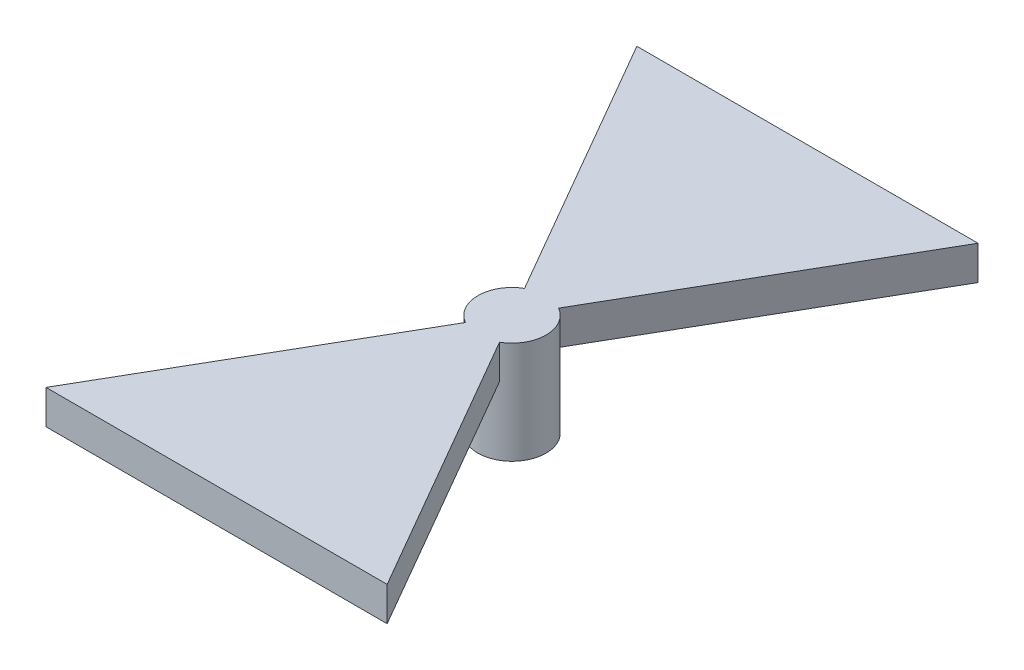
ISO-10303-21;
HEADER;
FILE_DESCRIPTION(('STEP AP214'),'2;1');
FILE_NAME('part.step','',(''),(''),'','','');
FILE_SCHEMA(('AUTOMOTIVE_DESIGN { 1 0 10303 214 1 1 1 1 }'));
ENDSEC;
DATA;
#1=APPLICATION_CONTEXT('core data for automotive mechanical design processes');
#2=APPLICATION_PROTOCOL_DEFINITION('international standard','automotive_design',2000,#1);
#3=PRODUCT_CONTEXT('',#1,'mechanical');
#4=PRODUCT('Part','Part','',(#3));
#5=PRODUCT_RELATED_PRODUCT_CATEGORY('part','',(#4));
#6=PRODUCT_DEFINITION_FORMATION('','',#4);
#7=PRODUCT_DEFINITION_CONTEXT('part definition',#1,'design');
#8=PRODUCT_DEFINITION('design','',#6,#7);
#9=PRODUCT_DEFINITION_SHAPE('','',#8);
#10=(LENGTH_UNIT() NAMED_UNIT(*) SI_UNIT(.MILLI.,.METRE.));
#11=(NAMED_UNIT(*) PLANE_ANGLE_UNIT() SI_UNIT($,.RADIAN.));
#12=(NAMED_UNIT(*) SI_UNIT($,.STERADIAN.) SOLID_ANGLE_UNIT());
#13=UNCERTAINTY_MEASURE_WITH_UNIT(LENGTH_MEASURE(1.E-05),#10,'distance_accuracy_value','');
#14=(GEOMETRIC_REPRESENTATION_CONTEXT(3) GLOBAL_UNCERTAINTY_ASSIGNED_CONTEXT((#13)) GLOBAL_UNIT_ASSIGNED_CONTEXT((#10,
#11,#12)) REPRESENTATION_CONTEXT('',''));
#15=CARTESIAN_POINT('',(0.,0.,0.));
#16=DIRECTION('',(0.,0.,1.));
#17=DIRECTION('',(1.,0.,0.));
#18=AXIS2_PLACEMENT_3D('',#15,#16,#17);
#19=CARTESIAN_POINT('',(0.,0.,0.));
#20=DIRECTION('',(0.,1.,0.));
#21=DIRECTION('',(0.,0.,1.));
#22=AXIS2_PLACEMENT_3D('',#19,#20,#21);
#23=PLANE('',#22);
#24=CARTESIAN_POINT('',(0.,0.,0.));
#25=DIRECTION('',(0.,1.,0.));
#26=DIRECTION('',(0.,0.,1.));
#27=AXIS2_PLACEMENT_3D('',#24,#25,#26);
#28=CIRCLE('',#27,2.);
#29=CARTESIAN_POINT('',(0.,0.,2.));
#30=VERTEX_POINT('',#29);
#31=EDGE_CURVE('E75',#30,#30,#28,.T.);
#32=ORIENTED_EDGE('',*,*,#31,.F.);
#33=EDGE_LOOP('',(#32));
#34=FACE_BOUND('',#33,.T.);
#35=CARTESIAN_POINT('',(0.,0.,0.));
#36=DIRECTION('',(0.,1.,0.));
#37=DIRECTION('',(0.,0.,1.));
#38=AXIS2_PLACEMENT_3D('',#35,#36,#37);
#39=CIRCLE('',#38,1.);
#40=CARTESIAN_POINT('',(0.,0.,1.));
#41=VERTEX_POINT('',#40);
#42=EDGE_CURVE('E227',#41,#41,#39,.T.);
#43=ORIENTED_EDGE('',*,*,#42,.T.);
#44=EDGE_LOOP('',(#43));
#45=FACE_BOUND('',#44,.T.);
#46=ADVANCED_FACE('F71',(#34,#45),#23,.F.);
#47=CARTESIAN_POINT('',(0.,4.,0.));
#48=DIRECTION('',(0.,-1.,0.));
#49=DIRECTION('',(0.,0.,-1.));
#50=AXIS2_PLACEMENT_3D('',#47,#48,#49);
#51=CYLINDRICAL_SURFACE('',#50,2.);
#52=CARTESIAN_POINT('',(0.,4.,0.));
#53=DIRECTION('',(0.,1.,0.));
#54=DIRECTION('',(0.,0.,1.));
#55=AXIS2_PLACEMENT_3D('',#52,#53,#54);
#56=CIRCLE('',#55,2.);
#57=CARTESIAN_POINT('',(1.00000000000001,4.,-1.73205080756887));
#58=VERTEX_POINT('',#57);
#59=CARTESIAN_POINT('',(-1.00000000000001,4.,-1.73205080756887));
#60=VERTEX_POINT('',#59);
#61=EDGE_CURVE('E12',#58,#60,#56,.T.);
#62=ORIENTED_EDGE('',*,*,#61,.F.);
#63=DIRECTION('',(0.,-1.,0.));
#64=VECTOR('',#63,1.);
#65=CARTESIAN_POINT('',(1.00000000000001,6.,-1.73205080756887));
#66=LINE('',#65,#64);
#67=CARTESIAN_POINT('',(1.00000000000001,6.,-1.73205080756887));
#68=VERTEX_POINT('',#67);
#69=EDGE_CURVE('E169',#68,#58,#66,.T.);
#70=ORIENTED_EDGE('',*,*,#69,.F.);
#71=CARTESIAN_POINT('',(0.,6.,0.));
#72=DIRECTION('',(0.,1.,0.));
#73=DIRECTION('',(0.,0.,1.));
#74=AXIS2_PLACEMENT_3D('',#71,#72,#73);
#75=CIRCLE('',#74,2.);
#76=CARTESIAN_POINT('',(1.00000000000001,6.,1.73205080756887));
#77=VERTEX_POINT('',#76);
#78=EDGE_CURVE('E160',#77,#68,#75,.T.);
#79=ORIENTED_EDGE('',*,*,#78,.F.);
#80=DIRECTION('',(0.,-1.,0.));
#81=VECTOR('',#80,1.);
#82=CARTESIAN_POINT('',(1.00000000000001,6.,1.73205080756887));
#83=LINE('',#82,#81);
#84=CARTESIAN_POINT('',(1.00000000000001,4.,1.73205080756887));
#85=VERTEX_POINT('',#84);
#86=EDGE_CURVE('E215',#77,#85,#83,.T.);
#87=ORIENTED_EDGE('',*,*,#86,.T.);
#88=CARTESIAN_POINT('',(-1.00000000000001,4.,1.73205080756887));
#89=VERTEX_POINT('',#88);
#90=EDGE_CURVE('E81',#89,#85,#56,.T.);
#91=ORIENTED_EDGE('',*,*,#90,.F.);
#92=DIRECTION('',(0.,-1.,0.));
#93=VECTOR('',#92,1.);
#94=CARTESIAN_POINT('',(-1.00000000000001,6.,1.73205080756887));
#95=LINE('',#94,#93);
#96=CARTESIAN_POINT('',(-1.00000000000001,6.,1.73205080756887));
#97=VERTEX_POINT('',#96);
#98=EDGE_CURVE('E212',#97,#89,#95,.T.);
#99=ORIENTED_EDGE('',*,*,#98,.F.);
#100=CARTESIAN_POINT('',(-1.00000000000001,6.,-1.73205080756887));
#101=VERTEX_POINT('',#100);
#102=EDGE_CURVE('E223',#101,#97,#75,.T.);
#103=ORIENTED_EDGE('',*,*,#102,.F.);
#104=DIRECTION('',(0.,-1.,0.));
#105=VECTOR('',#104,1.);
#106=CARTESIAN_POINT('',(-1.00000000000001,6.,-1.73205080756887));
#107=LINE('',#106,#105);
#108=EDGE_CURVE('E182',#101,#60,#107,.T.);
#109=ORIENTED_EDGE('',*,*,#108,.T.);
#110=EDGE_LOOP('',(#62,#70,#79,#87,#91,#99,#103,#109));
#111=FACE_BOUND('',#110,.T.);
#112=ORIENTED_EDGE('',*,*,#31,.T.);
#113=EDGE_LOOP('',(#112));
#114=FACE_BOUND('',#113,.T.);
#115=ADVANCED_FACE('F73',(#111,#114),#51,.T.);
#116=CARTESIAN_POINT('',(0.,4.,0.));
#117=DIRECTION('',(0.,-1.,0.));
#118=DIRECTION('',(0.,0.,-1.));
#119=AXIS2_PLACEMENT_3D('',#116,#117,#118);
#120=CYLINDRICAL_SURFACE('',#119,1.);
#121=CARTESIAN_POINT('',(0.,4.,0.));
#122=DIRECTION('',(0.,1.,0.));
#123=DIRECTION('',(0.,0.,1.));
#124=AXIS2_PLACEMENT_3D('',#121,#122,#123);
#125=CIRCLE('',#124,1.);
#126=CARTESIAN_POINT('',(0.,4.,1.));
#127=VERTEX_POINT('',#126);
#128=EDGE_CURVE('E148',#127,#127,#125,.T.);
#129=ORIENTED_EDGE('',*,*,#128,.T.);
#130=EDGE_LOOP('',(#129));
#131=FACE_BOUND('',#130,.T.);
#132=ORIENTED_EDGE('',*,*,#42,.F.);
#133=EDGE_LOOP('',(#132));
#134=FACE_BOUND('',#133,.T.);
#135=ADVANCED_FACE('F242',(#131,#134),#120,.F.);
#136=CARTESIAN_POINT('',(0.,4.,0.));
#137=DIRECTION('',(0.,1.,0.));
#138=DIRECTION('',(0.,0.,1.));
#139=AXIS2_PLACEMENT_3D('',#136,#137,#138);
#140=PLANE('',#139);
#141=ORIENTED_EDGE('',*,*,#128,.F.);
#142=EDGE_LOOP('',(#141));
#143=FACE_BOUND('',#142,.T.);
#144=ADVANCED_FACE('F244',(#143),#140,.F.);
#145=DIRECTION('',(-0.500000000000004,0.,0.866025403784436));
#146=VECTOR('',#145,1.);
#147=CARTESIAN_POINT('',(0.,4.,0.));
#148=LINE('',#147,#146);
#149=CARTESIAN_POINT('',(10.,4.,-17.3205080756886));
#150=VERTEX_POINT('',#149);
#151=EDGE_CURVE('E142',#150,#58,#148,.T.);
#152=ORIENTED_EDGE('',*,*,#151,.T.);
#153=ORIENTED_EDGE('',*,*,#61,.T.);
#154=DIRECTION('',(-0.500000000000004,0.,-0.866025403784436));
#155=VECTOR('',#154,1.);
#156=CARTESIAN_POINT('',(0.,4.,0.));
#157=LINE('',#156,#155);
#158=CARTESIAN_POINT('',(-10.,4.,-17.3205080756886));
#159=VERTEX_POINT('',#158);
#160=EDGE_CURVE('E162',#60,#159,#157,.T.);
#161=ORIENTED_EDGE('',*,*,#160,.T.);
#162=DIRECTION('',(1.,0.,0.));
#163=VECTOR('',#162,1.);
#164=CARTESIAN_POINT('',(0.,4.,-17.3205080756886));
#165=LINE('',#164,#163);
#166=EDGE_CURVE('E174',#159,#150,#165,.T.);
#167=ORIENTED_EDGE('',*,*,#166,.T.);
#168=EDGE_LOOP('',(#152,#153,#161,#167));
#169=FACE_BOUND('',#168,.T.);
#170=ADVANCED_FACE('F251',(#169),#140,.F.);
#171=DIRECTION('',(-0.500000000000004,0.,0.866025403784436));
#172=VECTOR('',#171,1.);
#173=CARTESIAN_POINT('',(0.,4.,0.));
#174=LINE('',#173,#172);
#175=CARTESIAN_POINT('',(-10.,4.,17.3205080756886));
#176=VERTEX_POINT('',#175);
#177=EDGE_CURVE('E192',#89,#176,#174,.T.);
#178=ORIENTED_EDGE('',*,*,#177,.F.);
#179=ORIENTED_EDGE('',*,*,#90,.T.);
#180=DIRECTION('',(-0.500000000000004,0.,-0.866025403784436));
#181=VECTOR('',#180,1.);
#182=CARTESIAN_POINT('',(0.,4.,0.));
#183=LINE('',#182,#181);
#184=CARTESIAN_POINT('',(10.,4.,17.3205080756886));
#185=VERTEX_POINT('',#184);
#186=EDGE_CURVE('E203',#185,#85,#183,.T.);
#187=ORIENTED_EDGE('',*,*,#186,.F.);
#188=DIRECTION('',(1.,0.,0.));
#189=VECTOR('',#188,1.);
#190=CARTESIAN_POINT('',(0.,4.,17.3205080756886));
#191=LINE('',#190,#189);
#192=EDGE_CURVE('E199',#176,#185,#191,.T.);
#193=ORIENTED_EDGE('',*,*,#192,.F.);
#194=EDGE_LOOP('',(#178,#179,#187,#193));
#195=FACE_BOUND('',#194,.T.);
#196=ADVANCED_FACE('F254',(#195),#140,.F.);
#197=CARTESIAN_POINT('',(0.,6.,-17.3205080756886));
#198=DIRECTION('',(0.,0.,-1.));
#199=DIRECTION('',(-1.,0.,0.));
#200=AXIS2_PLACEMENT_3D('',#197,#198,#199);
#201=PLANE('',#200);
#202=ORIENTED_EDGE('',*,*,#166,.F.);
#203=DIRECTION('',(0.,-1.,0.));
#204=VECTOR('',#203,1.);
#205=CARTESIAN_POINT('',(-10.,6.,-17.3205080756886));
#206=LINE('',#205,#204);
#207=CARTESIAN_POINT('',(-10.,6.,-17.3205080756886));
#208=VERTEX_POINT('',#207);
#209=EDGE_CURVE('E149',#208,#159,#206,.T.);
#210=ORIENTED_EDGE('',*,*,#209,.F.);
#211=DIRECTION('',(1.,0.,0.));
#212=VECTOR('',#211,1.);
#213=CARTESIAN_POINT('',(0.,6.,-17.3205080756886));
#214=LINE('',#213,#212);
#215=CARTESIAN_POINT('',(10.,6.,-17.3205080756886));
#216=VERTEX_POINT('',#215);
#217=EDGE_CURVE('E156',#208,#216,#214,.T.);
#218=ORIENTED_EDGE('',*,*,#217,.T.);
#219=DIRECTION('',(0.,-1.,0.));
#220=VECTOR('',#219,1.);
#221=CARTESIAN_POINT('',(10.,6.,-17.3205080756886));
#222=LINE('',#221,#220);
#223=EDGE_CURVE('E137',#216,#150,#222,.T.);
#224=ORIENTED_EDGE('',*,*,#223,.T.);
#225=EDGE_LOOP('',(#202,#210,#218,#224));
#226=FACE_BOUND('',#225,.T.);
#227=ADVANCED_FACE('F164',(#226),#201,.T.);
#228=CARTESIAN_POINT('',(0.,6.,0.));
#229=DIRECTION('',(-0.866025403784436,0.,0.500000000000004));
#230=DIRECTION('',(0.500000000000004,0.,0.866025403784436));
#231=AXIS2_PLACEMENT_3D('',#228,#229,#230);
#232=PLANE('',#231);
#233=ORIENTED_EDGE('',*,*,#160,.F.);
#234=ORIENTED_EDGE('',*,*,#108,.F.);
#235=DIRECTION('',(-0.500000000000004,0.,-0.866025403784436));
#236=VECTOR('',#235,1.);
#237=CARTESIAN_POINT('',(0.,6.,0.));
#238=LINE('',#237,#236);
#239=EDGE_CURVE('E166',#101,#208,#238,.T.);
#240=ORIENTED_EDGE('',*,*,#239,.T.);
#241=ORIENTED_EDGE('',*,*,#209,.T.);
#242=EDGE_LOOP('',(#233,#234,#240,#241));
#243=FACE_BOUND('',#242,.T.);
#244=ADVANCED_FACE('F270',(#243),#232,.T.);
#245=CARTESIAN_POINT('',(0.,6.,0.));
#246=DIRECTION('',(0.866025403784436,0.,0.500000000000004));
#247=DIRECTION('',(0.500000000000004,0.,-0.866025403784436));
#248=AXIS2_PLACEMENT_3D('',#245,#246,#247);
#249=PLANE('',#248);
#250=ORIENTED_EDGE('',*,*,#151,.F.);
#251=ORIENTED_EDGE('',*,*,#223,.F.);
#252=DIRECTION('',(-0.500000000000004,0.,0.866025403784436));
#253=VECTOR('',#252,1.);
#254=CARTESIAN_POINT('',(0.,6.,0.));
#255=LINE('',#254,#253);
#256=EDGE_CURVE('E141',#216,#68,#255,.T.);
#257=ORIENTED_EDGE('',*,*,#256,.T.);
#258=ORIENTED_EDGE('',*,*,#69,.T.);
#259=EDGE_LOOP('',(#250,#251,#257,#258));
#260=FACE_BOUND('',#259,.T.);
#261=ADVANCED_FACE('F139',(#260),#249,.T.);
#262=CARTESIAN_POINT('',(0.,6.,0.));
#263=DIRECTION('',(0.,1.,0.));
#264=DIRECTION('',(0.,0.,1.));
#265=AXIS2_PLACEMENT_3D('',#262,#263,#264);
#266=PLANE('',#265);
#267=ORIENTED_EDGE('',*,*,#256,.F.);
#268=ORIENTED_EDGE('',*,*,#217,.F.);
#269=ORIENTED_EDGE('',*,*,#239,.F.);
#270=ORIENTED_EDGE('',*,*,#102,.T.);
#271=DIRECTION('',(-0.500000000000004,0.,0.866025403784436));
#272=VECTOR('',#271,1.);
#273=CARTESIAN_POINT('',(0.,6.,0.));
#274=LINE('',#273,#272);
#275=CARTESIAN_POINT('',(-10.,6.,17.3205080756886));
#276=VERTEX_POINT('',#275);
#277=EDGE_CURVE('E195',#97,#276,#274,.T.);
#278=ORIENTED_EDGE('',*,*,#277,.T.);
#279=DIRECTION('',(1.,0.,0.));
#280=VECTOR('',#279,1.);
#281=CARTESIAN_POINT('',(0.,6.,17.3205080756886));
#282=LINE('',#281,#280);
#283=CARTESIAN_POINT('',(10.,6.,17.3205080756886));
#284=VERTEX_POINT('',#283);
#285=EDGE_CURVE('E187',#276,#284,#282,.T.);
#286=ORIENTED_EDGE('',*,*,#285,.T.);
#287=DIRECTION('',(-0.500000000000004,0.,-0.866025403784436));
#288=VECTOR('',#287,1.);
#289=CARTESIAN_POINT('',(0.,6.,0.));
#290=LINE('',#289,#288);
#291=EDGE_CURVE('E191',#284,#77,#290,.T.);
#292=ORIENTED_EDGE('',*,*,#291,.T.);
#293=ORIENTED_EDGE('',*,*,#78,.T.);
#294=EDGE_LOOP('',(#267,#268,#269,#270,#278,#286,#292,#293));
#295=FACE_BOUND('',#294,.T.);
#296=ADVANCED_FACE('F154',(#295),#266,.T.);
#297=CARTESIAN_POINT('',(0.,6.,17.3205080756886));
#298=DIRECTION('',(0.,0.,-1.));
#299=DIRECTION('',(-1.,0.,0.));
#300=AXIS2_PLACEMENT_3D('',#297,#298,#299);
#301=PLANE('',#300);
#302=ORIENTED_EDGE('',*,*,#192,.T.);
#303=DIRECTION('',(0.,-1.,0.));
#304=VECTOR('',#303,1.);
#305=CARTESIAN_POINT('',(10.,6.,17.3205080756886));
#306=LINE('',#305,#304);
#307=EDGE_CURVE('E175',#284,#185,#306,.T.);
#308=ORIENTED_EDGE('',*,*,#307,.F.);
#309=ORIENTED_EDGE('',*,*,#285,.F.);
#310=DIRECTION('',(0.,-1.,0.));
#311=VECTOR('',#310,1.);
#312=CARTESIAN_POINT('',(-10.,6.,17.3205080756886));
#313=LINE('',#312,#311);
#314=EDGE_CURVE('E198',#276,#176,#313,.T.);
#315=ORIENTED_EDGE('',*,*,#314,.T.);
#316=EDGE_LOOP('',(#302,#308,#309,#315));
#317=FACE_BOUND('',#316,.T.);
#318=ADVANCED_FACE('F256',(#317),#301,.F.);
#319=CARTESIAN_POINT('',(0.,6.,0.));
#320=DIRECTION('',(-0.866025403784436,0.,0.500000000000004));
#321=DIRECTION('',(0.500000000000004,0.,0.866025403784436));
#322=AXIS2_PLACEMENT_3D('',#319,#320,#321);
#323=PLANE('',#322);
#324=ORIENTED_EDGE('',*,*,#186,.T.);
#325=ORIENTED_EDGE('',*,*,#86,.F.);
#326=ORIENTED_EDGE('',*,*,#291,.F.);
#327=ORIENTED_EDGE('',*,*,#307,.T.);
#328=EDGE_LOOP('',(#324,#325,#326,#327));
#329=FACE_BOUND('',#328,.T.);
#330=ADVANCED_FACE('F259',(#329),#323,.F.);
#331=CARTESIAN_POINT('',(0.,6.,0.));
#332=DIRECTION('',(0.866025403784436,0.,0.500000000000004));
#333=DIRECTION('',(0.500000000000004,0.,-0.866025403784436));
#334=AXIS2_PLACEMENT_3D('',#331,#332,#333);
#335=PLANE('',#334);
#336=ORIENTED_EDGE('',*,*,#177,.T.);
#337=ORIENTED_EDGE('',*,*,#314,.F.);
#338=ORIENTED_EDGE('',*,*,#277,.F.);
#339=ORIENTED_EDGE('',*,*,#98,.T.);
#340=EDGE_LOOP('',(#336,#337,#338,#339));
#341=FACE_BOUND('',#340,.T.);
#342=ADVANCED_FACE('F261',(#341),#335,.F.);
#343=CLOSED_SHELL('',(#46,#115,#135,#144,#170,#196,#227,#244,#261,#296,#318,#330,#342));
#344=MANIFOLD_SOLID_BREP('B2',#343);
#345=ADVANCED_BREP_SHAPE_REPRESENTATION('',(#18,#344),#14);
#346=SHAPE_DEFINITION_REPRESENTATION(#9,#345);
ENDSEC;
END-ISO-10303-21;
